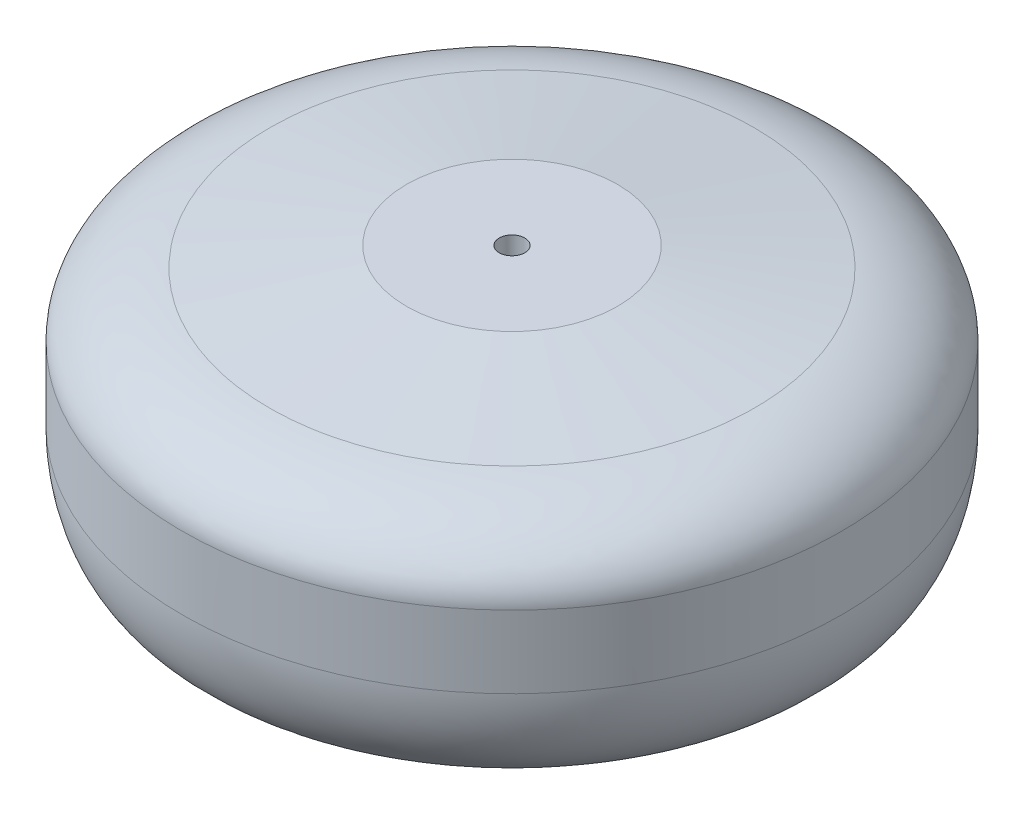
ISO-10303-21;
HEADER;
FILE_DESCRIPTION(('STEP AP214'),'2;1');
FILE_NAME('part.step','',(''),(''),'','','');
FILE_SCHEMA(('AUTOMOTIVE_DESIGN { 1 0 10303 214 1 1 1 1 }'));
ENDSEC;
DATA;
#1=APPLICATION_CONTEXT('core data for automotive mechanical design processes');
#2=APPLICATION_PROTOCOL_DEFINITION('international standard','automotive_design',2000,#1);
#3=PRODUCT_CONTEXT('',#1,'mechanical');
#4=PRODUCT('Part','Part','',(#3));
#5=PRODUCT_RELATED_PRODUCT_CATEGORY('part','',(#4));
#6=PRODUCT_DEFINITION_FORMATION('','',#4);
#7=PRODUCT_DEFINITION_CONTEXT('part definition',#1,'design');
#8=PRODUCT_DEFINITION('design','',#6,#7);
#9=PRODUCT_DEFINITION_SHAPE('','',#8);
#10=(LENGTH_UNIT() NAMED_UNIT(*) SI_UNIT(.MILLI.,.METRE.));
#11=(NAMED_UNIT(*) PLANE_ANGLE_UNIT() SI_UNIT($,.RADIAN.));
#12=(NAMED_UNIT(*) SI_UNIT($,.STERADIAN.) SOLID_ANGLE_UNIT());
#13=UNCERTAINTY_MEASURE_WITH_UNIT(LENGTH_MEASURE(1.E-05),#10,'distance_accuracy_value','');
#14=(GEOMETRIC_REPRESENTATION_CONTEXT(3) GLOBAL_UNCERTAINTY_ASSIGNED_CONTEXT((#13)) GLOBAL_UNIT_ASSIGNED_CONTEXT((#10,
#11,#12)) REPRESENTATION_CONTEXT('',''));
#15=CARTESIAN_POINT('',(0.,0.,0.));
#16=DIRECTION('',(0.,0.,1.));
#17=DIRECTION('',(1.,0.,0.));
#18=AXIS2_PLACEMENT_3D('',#15,#16,#17);
#19=CARTESIAN_POINT('',(0.,43.,0.));
#20=DIRECTION('',(0.,-1.,0.));
#21=DIRECTION('',(0.,0.,-1.));
#22=AXIS2_PLACEMENT_3D('',#19,#20,#21);
#23=CYLINDRICAL_SURFACE('',#22,22.5);
#24=CARTESIAN_POINT('',(0.,7.5,0.));
#25=DIRECTION('',(0.,1.,0.));
#26=DIRECTION('',(0.,0.,1.));
#27=AXIS2_PLACEMENT_3D('',#24,#25,#26);
#28=CIRCLE('',#27,22.5);
#29=CARTESIAN_POINT('',(0.,7.5,22.5));
#30=VERTEX_POINT('',#29);
#31=EDGE_CURVE('E169',#30,#30,#28,.T.);
#32=ORIENTED_EDGE('',*,*,#31,.T.);
#33=EDGE_LOOP('',(#32));
#34=FACE_BOUND('',#33,.T.);
#35=CARTESIAN_POINT('',(0.,0.857142857142858,0.));
#36=DIRECTION('',(0.,1.,0.));
#37=DIRECTION('',(0.,0.,1.));
#38=AXIS2_PLACEMENT_3D('',#35,#36,#37);
#39=CIRCLE('',#38,22.5);
#40=CARTESIAN_POINT('',(0.,0.857142857142858,22.5));
#41=VERTEX_POINT('',#40);
#42=EDGE_CURVE('E452',#41,#41,#39,.F.);
#43=ORIENTED_EDGE('',*,*,#42,.T.);
#44=EDGE_LOOP('',(#43));
#45=FACE_BOUND('',#44,.T.);
#46=ADVANCED_FACE('F48',(#34,#45),#23,.F.);
#47=CARTESIAN_POINT('',(0.,43.,0.));
#48=DIRECTION('',(0.,1.,0.));
#49=DIRECTION('',(0.,0.,1.));
#50=AXIS2_PLACEMENT_3D('',#47,#48,#49);
#51=PLANE('',#50);
#52=CARTESIAN_POINT('',(0.,43.,0.));
#53=DIRECTION('',(0.,1.,0.));
#54=DIRECTION('',(0.,0.,1.));
#55=AXIS2_PLACEMENT_3D('',#52,#53,#54);
#56=CIRCLE('',#55,2.);
#57=CARTESIAN_POINT('',(0.,43.,2.));
#58=VERTEX_POINT('',#57);
#59=EDGE_CURVE('E151',#58,#58,#56,.T.);
#60=ORIENTED_EDGE('',*,*,#59,.F.);
#61=EDGE_LOOP('',(#60));
#62=FACE_BOUND('',#61,.T.);
#63=CARTESIAN_POINT('',(0.,43.,0.));
#64=DIRECTION('',(0.,-1.,0.));
#65=DIRECTION('',(0.,0.,-1.));
#66=AXIS2_PLACEMENT_3D('',#63,#64,#65);
#67=CIRCLE('',#66,16.5);
#68=CARTESIAN_POINT('',(0.,43.,-16.5));
#69=VERTEX_POINT('',#68);
#70=EDGE_CURVE('E449',#69,#69,#67,.T.);
#71=ORIENTED_EDGE('',*,*,#70,.F.);
#72=EDGE_LOOP('',(#71));
#73=FACE_BOUND('',#72,.T.);
#74=ADVANCED_FACE('F237',(#62,#73),#51,.T.);
#75=CARTESIAN_POINT('',(0.,7.5,0.));
#76=DIRECTION('',(0.,1.,0.));
#77=DIRECTION('',(0.,0.,1.));
#78=AXIS2_PLACEMENT_3D('',#75,#76,#77);
#79=PLANE('',#78);
#80=ORIENTED_EDGE('',*,*,#31,.F.);
#81=EDGE_LOOP('',(#80));
#82=FACE_BOUND('',#81,.T.);
#83=DIRECTION('',(-0.866025403784439,0.,0.5));
#84=VECTOR('',#83,1.);
#85=CARTESIAN_POINT('',(6.05,7.5,3.49296912859724));
#86=LINE('',#85,#84);
#87=CARTESIAN_POINT('',(6.05,7.5,3.49296912859724));
#88=VERTEX_POINT('',#87);
#89=CARTESIAN_POINT('',(0.,7.5,6.98593825719447));
#90=VERTEX_POINT('',#89);
#91=EDGE_CURVE('E147',#88,#90,#86,.T.);
#92=ORIENTED_EDGE('',*,*,#91,.F.);
#93=DIRECTION('',(0.,0.,1.));
#94=VECTOR('',#93,1.);
#95=CARTESIAN_POINT('',(6.05,7.5,-3.49296912859724));
#96=LINE('',#95,#94);
#97=CARTESIAN_POINT('',(6.05,7.5,-3.49296912859724));
#98=VERTEX_POINT('',#97);
#99=EDGE_CURVE('E163',#98,#88,#96,.T.);
#100=ORIENTED_EDGE('',*,*,#99,.F.);
#101=DIRECTION('',(0.866025403784439,0.,0.5));
#102=VECTOR('',#101,1.);
#103=CARTESIAN_POINT('',(0.,7.5,-6.98593825719447));
#104=LINE('',#103,#102);
#105=CARTESIAN_POINT('',(0.,7.5,-6.98593825719447));
#106=VERTEX_POINT('',#105);
#107=EDGE_CURVE('E70',#106,#98,#104,.T.);
#108=ORIENTED_EDGE('',*,*,#107,.F.);
#109=DIRECTION('',(0.866025403784439,0.,-0.5));
#110=VECTOR('',#109,1.);
#111=CARTESIAN_POINT('',(-6.05,7.5,-3.49296912859724));
#112=LINE('',#111,#110);
#113=CARTESIAN_POINT('',(-6.05,7.5,-3.49296912859724));
#114=VERTEX_POINT('',#113);
#115=EDGE_CURVE('E120',#114,#106,#112,.T.);
#116=ORIENTED_EDGE('',*,*,#115,.F.);
#117=DIRECTION('',(0.,0.,-1.));
#118=VECTOR('',#117,1.);
#119=CARTESIAN_POINT('',(-6.05,7.5,3.49296912859724));
#120=LINE('',#119,#118);
#121=CARTESIAN_POINT('',(-6.05,7.5,3.49296912859724));
#122=VERTEX_POINT('',#121);
#123=EDGE_CURVE('E155',#122,#114,#120,.T.);
#124=ORIENTED_EDGE('',*,*,#123,.F.);
#125=DIRECTION('',(-0.866025403784439,0.,-0.5));
#126=VECTOR('',#125,1.);
#127=CARTESIAN_POINT('',(0.,7.5,6.98593825719447));
#128=LINE('',#127,#126);
#129=EDGE_CURVE('E150',#90,#122,#128,.T.);
#130=ORIENTED_EDGE('',*,*,#129,.F.);
#131=EDGE_LOOP('',(#92,#100,#108,#116,#124,#130));
#132=FACE_BOUND('',#131,.T.);
#133=ADVANCED_FACE('F234',(#82,#132),#79,.F.);
#134=CARTESIAN_POINT('',(6.05,20.,3.49296912859724));
#135=DIRECTION('',(0.5,0.,0.866025403784439));
#136=DIRECTION('',(0.866025403784439,0.,-0.5));
#137=AXIS2_PLACEMENT_3D('',#134,#135,#136);
#138=PLANE('',#137);
#139=ORIENTED_EDGE('',*,*,#91,.T.);
#140=DIRECTION('',(0.,-1.,0.));
#141=VECTOR('',#140,1.);
#142=CARTESIAN_POINT('',(0.,20.,6.98593825719447));
#143=LINE('',#142,#141);
#144=CARTESIAN_POINT('',(0.,20.,6.98593825719447));
#145=VERTEX_POINT('',#144);
#146=EDGE_CURVE('E102',#145,#90,#143,.T.);
#147=ORIENTED_EDGE('',*,*,#146,.F.);
#148=DIRECTION('',(-0.866025403784439,0.,0.5));
#149=VECTOR('',#148,1.);
#150=CARTESIAN_POINT('',(6.05,20.,3.49296912859724));
#151=LINE('',#150,#149);
#152=CARTESIAN_POINT('',(6.05,20.,3.49296912859724));
#153=VERTEX_POINT('',#152);
#154=EDGE_CURVE('E166',#153,#145,#151,.T.);
#155=ORIENTED_EDGE('',*,*,#154,.F.);
#156=DIRECTION('',(0.,-1.,0.));
#157=VECTOR('',#156,1.);
#158=CARTESIAN_POINT('',(6.05,20.,3.49296912859724));
#159=LINE('',#158,#157);
#160=EDGE_CURVE('E79',#153,#88,#159,.T.);
#161=ORIENTED_EDGE('',*,*,#160,.T.);
#162=EDGE_LOOP('',(#139,#147,#155,#161));
#163=FACE_BOUND('',#162,.T.);
#164=ADVANCED_FACE('F220',(#163),#138,.F.);
#165=CARTESIAN_POINT('',(6.05,20.,-3.49296912859724));
#166=DIRECTION('',(1.,0.,0.));
#167=DIRECTION('',(0.,0.,-1.));
#168=AXIS2_PLACEMENT_3D('',#165,#166,#167);
#169=PLANE('',#168);
#170=ORIENTED_EDGE('',*,*,#99,.T.);
#171=ORIENTED_EDGE('',*,*,#160,.F.);
#172=DIRECTION('',(0.,0.,1.));
#173=VECTOR('',#172,1.);
#174=CARTESIAN_POINT('',(6.05,20.,-3.49296912859724));
#175=LINE('',#174,#173);
#176=CARTESIAN_POINT('',(6.05,20.,-3.49296912859724));
#177=VERTEX_POINT('',#176);
#178=EDGE_CURVE('E131',#177,#153,#175,.T.);
#179=ORIENTED_EDGE('',*,*,#178,.F.);
#180=DIRECTION('',(0.,-1.,0.));
#181=VECTOR('',#180,1.);
#182=CARTESIAN_POINT('',(6.05,20.,-3.49296912859724));
#183=LINE('',#182,#181);
#184=EDGE_CURVE('E122',#177,#98,#183,.T.);
#185=ORIENTED_EDGE('',*,*,#184,.T.);
#186=EDGE_LOOP('',(#170,#171,#179,#185));
#187=FACE_BOUND('',#186,.T.);
#188=ADVANCED_FACE('F217',(#187),#169,.F.);
#189=CARTESIAN_POINT('',(0.,20.,-6.98593825719447));
#190=DIRECTION('',(0.5,0.,-0.866025403784439));
#191=DIRECTION('',(-0.866025403784439,0.,-0.5));
#192=AXIS2_PLACEMENT_3D('',#189,#190,#191);
#193=PLANE('',#192);
#194=ORIENTED_EDGE('',*,*,#107,.T.);
#195=ORIENTED_EDGE('',*,*,#184,.F.);
#196=DIRECTION('',(0.866025403784439,0.,0.5));
#197=VECTOR('',#196,1.);
#198=CARTESIAN_POINT('',(0.,20.,-6.98593825719447));
#199=LINE('',#198,#197);
#200=CARTESIAN_POINT('',(0.,20.,-6.98593825719447));
#201=VERTEX_POINT('',#200);
#202=EDGE_CURVE('E126',#201,#177,#199,.T.);
#203=ORIENTED_EDGE('',*,*,#202,.F.);
#204=DIRECTION('',(0.,-1.,0.));
#205=VECTOR('',#204,1.);
#206=CARTESIAN_POINT('',(0.,20.,-6.98593825719447));
#207=LINE('',#206,#205);
#208=EDGE_CURVE('E113',#201,#106,#207,.T.);
#209=ORIENTED_EDGE('',*,*,#208,.T.);
#210=EDGE_LOOP('',(#194,#195,#203,#209));
#211=FACE_BOUND('',#210,.T.);
#212=ADVANCED_FACE('F127',(#211),#193,.F.);
#213=CARTESIAN_POINT('',(-6.05,20.,-3.49296912859724));
#214=DIRECTION('',(-0.5,0.,-0.866025403784439));
#215=DIRECTION('',(-0.866025403784439,0.,0.5));
#216=AXIS2_PLACEMENT_3D('',#213,#214,#215);
#217=PLANE('',#216);
#218=ORIENTED_EDGE('',*,*,#115,.T.);
#219=ORIENTED_EDGE('',*,*,#208,.F.);
#220=DIRECTION('',(0.866025403784439,0.,-0.5));
#221=VECTOR('',#220,1.);
#222=CARTESIAN_POINT('',(-6.05,20.,-3.49296912859724));
#223=LINE('',#222,#221);
#224=CARTESIAN_POINT('',(-6.05,20.,-3.49296912859724));
#225=VERTEX_POINT('',#224);
#226=EDGE_CURVE('E117',#225,#201,#223,.T.);
#227=ORIENTED_EDGE('',*,*,#226,.F.);
#228=DIRECTION('',(0.,-1.,0.));
#229=VECTOR('',#228,1.);
#230=CARTESIAN_POINT('',(-6.05,20.,-3.49296912859724));
#231=LINE('',#230,#229);
#232=EDGE_CURVE('E123',#225,#114,#231,.T.);
#233=ORIENTED_EDGE('',*,*,#232,.T.);
#234=EDGE_LOOP('',(#218,#219,#227,#233));
#235=FACE_BOUND('',#234,.T.);
#236=ADVANCED_FACE('F115',(#235),#217,.F.);
#237=CARTESIAN_POINT('',(-6.05,20.,3.49296912859724));
#238=DIRECTION('',(-1.,0.,0.));
#239=DIRECTION('',(0.,0.,1.));
#240=AXIS2_PLACEMENT_3D('',#237,#238,#239);
#241=PLANE('',#240);
#242=ORIENTED_EDGE('',*,*,#123,.T.);
#243=ORIENTED_EDGE('',*,*,#232,.F.);
#244=DIRECTION('',(0.,0.,-1.));
#245=VECTOR('',#244,1.);
#246=CARTESIAN_POINT('',(-6.05,20.,3.49296912859724));
#247=LINE('',#246,#245);
#248=CARTESIAN_POINT('',(-6.05,20.,3.49296912859724));
#249=VERTEX_POINT('',#248);
#250=EDGE_CURVE('E137',#249,#225,#247,.T.);
#251=ORIENTED_EDGE('',*,*,#250,.F.);
#252=DIRECTION('',(0.,-1.,0.));
#253=VECTOR('',#252,1.);
#254=CARTESIAN_POINT('',(-6.05,20.,3.49296912859724));
#255=LINE('',#254,#253);
#256=EDGE_CURVE('E174',#249,#122,#255,.T.);
#257=ORIENTED_EDGE('',*,*,#256,.T.);
#258=EDGE_LOOP('',(#242,#243,#251,#257));
#259=FACE_BOUND('',#258,.T.);
#260=ADVANCED_FACE('F225',(#259),#241,.F.);
#261=CARTESIAN_POINT('',(0.,20.,6.98593825719447));
#262=DIRECTION('',(-0.5,0.,0.866025403784439));
#263=DIRECTION('',(0.866025403784439,0.,0.5));
#264=AXIS2_PLACEMENT_3D('',#261,#262,#263);
#265=PLANE('',#264);
#266=ORIENTED_EDGE('',*,*,#129,.T.);
#267=ORIENTED_EDGE('',*,*,#256,.F.);
#268=DIRECTION('',(-0.866025403784439,0.,-0.5));
#269=VECTOR('',#268,1.);
#270=CARTESIAN_POINT('',(0.,20.,6.98593825719447));
#271=LINE('',#270,#269);
#272=EDGE_CURVE('E141',#145,#249,#271,.T.);
#273=ORIENTED_EDGE('',*,*,#272,.F.);
#274=ORIENTED_EDGE('',*,*,#146,.T.);
#275=EDGE_LOOP('',(#266,#267,#273,#274));
#276=FACE_BOUND('',#275,.T.);
#277=ADVANCED_FACE('F215',(#276),#265,.F.);
#278=CARTESIAN_POINT('',(0.,20.,0.));
#279=DIRECTION('',(0.,-1.,0.));
#280=DIRECTION('',(0.,0.,-1.));
#281=AXIS2_PLACEMENT_3D('',#278,#279,#280);
#282=PLANE('',#281);
#283=CARTESIAN_POINT('',(0.,20.,0.));
#284=DIRECTION('',(0.,-1.,0.));
#285=DIRECTION('',(0.,0.,-1.));
#286=AXIS2_PLACEMENT_3D('',#283,#284,#285);
#287=CIRCLE('',#286,2.);
#288=CARTESIAN_POINT('',(0.,20.,-2.));
#289=VERTEX_POINT('',#288);
#290=EDGE_CURVE('E186',#289,#289,#287,.T.);
#291=ORIENTED_EDGE('',*,*,#290,.F.);
#292=EDGE_LOOP('',(#291));
#293=FACE_BOUND('',#292,.T.);
#294=ORIENTED_EDGE('',*,*,#154,.T.);
#295=ORIENTED_EDGE('',*,*,#272,.T.);
#296=ORIENTED_EDGE('',*,*,#250,.T.);
#297=ORIENTED_EDGE('',*,*,#226,.T.);
#298=ORIENTED_EDGE('',*,*,#202,.T.);
#299=ORIENTED_EDGE('',*,*,#178,.T.);
#300=EDGE_LOOP('',(#294,#295,#296,#297,#298,#299));
#301=FACE_BOUND('',#300,.T.);
#302=ADVANCED_FACE('F134',(#293,#301),#282,.T.);
#303=CARTESIAN_POINT('',(0.,143.,0.));
#304=DIRECTION('',(0.,-1.,0.));
#305=DIRECTION('',(0.,0.,-1.));
#306=AXIS2_PLACEMENT_3D('',#303,#304,#305);
#307=CYLINDRICAL_SURFACE('',#306,2.);
#308=ORIENTED_EDGE('',*,*,#59,.T.);
#309=EDGE_LOOP('',(#308));
#310=FACE_BOUND('',#309,.T.);
#311=ORIENTED_EDGE('',*,*,#290,.T.);
#312=EDGE_LOOP('',(#311));
#313=FACE_BOUND('',#312,.T.);
#314=ADVANCED_FACE('F208',(#310,#313),#307,.F.);
#315=CARTESIAN_POINT('',(0.,0.,0.));
#316=DIRECTION('',(0.,1.,0.));
#317=DIRECTION('',(0.,0.,1.));
#318=AXIS2_PLACEMENT_3D('',#315,#316,#317);
#319=CONICAL_SURFACE('',#318,16.5,1.42889927219073);
#320=CARTESIAN_POINT('',(0.,3.87447433479423,-43.6213203435596));
#321=CARTESIAN_POINT('',(-5.71001747991467,3.87447433479423,-43.6213203435596));
#322=CARTESIAN_POINT('',(-11.4177883133907,3.87447433479568,-42.4859741346244));
#323=CARTESIAN_POINT('',(-21.9685248733502,3.87447433479278,-38.1157159584416));
#324=CARTESIAN_POINT('',(-26.8073393384969,3.8744743347933,-34.8825234999773));
#325=CARTESIAN_POINT('',(-34.8825234999866,3.87447433479517,-26.8073393385061));
#326=CARTESIAN_POINT('',(-38.1157159584796,3.87447433479462,-21.9685248732919));
#327=CARTESIAN_POINT('',(-42.4859741345862,3.87447433479384,-11.4177883134492));
#328=CARTESIAN_POINT('',(-43.6213203435596,3.87447433479423,-5.71001747986203));
#329=CARTESIAN_POINT('',(-43.6213203435596,3.87447433479423,5.71001747986209));
#330=CARTESIAN_POINT('',(-42.4859741346049,3.87447433479527,11.4177883134302));
#331=CARTESIAN_POINT('',(-38.115715958461,3.87447433479319,21.9685248733108));
#332=CARTESIAN_POINT('',(-34.8825235000434,3.87447433479423,26.80733933844));
#333=CARTESIAN_POINT('',(-26.80733933844,3.87447433479423,34.8825235000435));
#334=CARTESIAN_POINT('',(-21.9685248733043,3.87447433479472,38.1157159584752));
#335=CARTESIAN_POINT('',(-11.4177883134367,3.87447433479375,42.4859741345907));
#336=CARTESIAN_POINT('',(-5.71001747992563,3.87447433479423,43.6213203435596));
#337=CARTESIAN_POINT('',(5.71001747992563,3.87447433479423,43.6213203435596));
#338=CARTESIAN_POINT('',(11.4177883133896,3.87447433479366,42.4859741346095));
#339=CARTESIAN_POINT('',(21.9685248733514,3.8744743347948,38.1157159584564));
#340=CARTESIAN_POINT('',(26.8073393384956,3.87447433479404,34.882523499986));
#341=CARTESIAN_POINT('',(34.8825234999878,3.87447433479442,26.8073393384975));
#342=CARTESIAN_POINT('',(38.1157159584608,3.87447433479471,21.968524873339));
#343=CARTESIAN_POINT('',(42.4859741346051,3.87447433479376,11.417788313402));
#344=CARTESIAN_POINT('',(43.6213203435596,3.87447433479423,5.71001747991468));
#345=CARTESIAN_POINT('',(43.6213203435596,3.87447433479423,-5.71001747991467));
#346=CARTESIAN_POINT('',(42.4859741346052,3.87447433479325,-11.4177883133927));
#347=CARTESIAN_POINT('',(38.1157159584607,3.87447433479521,-21.9685248733484));
#348=CARTESIAN_POINT('',(34.8825234999866,3.87447433479423,-26.8073393384968));
#349=CARTESIAN_POINT('',(26.8073393384968,3.87447433479423,-34.8825234999867));
#350=CARTESIAN_POINT('',(21.9685248733408,3.87447433479472,-38.1157159584601));
#351=CARTESIAN_POINT('',(11.4177883134004,3.87447433479375,-42.4859741346058));
#352=CARTESIAN_POINT('',(5.71001747991468,3.87447433479423,-43.6213203435596));
#353=CARTESIAN_POINT('',(0.,3.87447433479423,-43.6213203435596));
#354=(BOUNDED_CURVE() B_SPLINE_CURVE(3,(#320,#321,#322,#323,#324,#325,#326,#327,#328,#329,#330,
#331,#332,#333,#334,#335,#336,#337,#338,#339,#340,#341,#342,#343,#344,#345,#346,#347,#348,#349,
#350,#351,#352,#353),.UNSPECIFIED.,.T.,.F.) B_SPLINE_CURVE_WITH_KNOTS((4,2,2,2,2,2,2,2,2,2,2,2,
2,2,2,2,4),(-3.14159265358979,-2.74889357189107,-2.35619449019234,-1.96349540849362,
-1.5707963267949,-1.17809724509617,-0.785398163397448,-0.392699081698724,0.,0.392699081698724,
0.785398163397448,1.17809724509617,1.5707963267949,1.96349540849362,2.35619449019234,
2.74889357189107,3.14159265358979),
.UNSPECIFIED.) CURVE() GEOMETRIC_REPRESENTATION_ITEM() RATIONAL_B_SPLINE_CURVE((1.,1.,1.,1.,1.,
1.,1.,1.,1.,1.,1.,1.,1.,1.,1.,1.,1.,1.,1.,1.,1.,1.,1.,1.,1.,1.,1.,1.,1.,1.,1.,1.,1.,1.)) REPRESENTATION_ITEM(''));
#355=CARTESIAN_POINT('',(0.,3.87447433479423,-43.6213203435596));
#356=VERTEX_POINT('',#355);
#357=EDGE_CURVE('E182',#356,#356,#354,.F.);
#358=ORIENTED_EDGE('',*,*,#357,.T.);
#359=EDGE_LOOP('',(#358));
#360=FACE_BOUND('',#359,.T.);
#361=ORIENTED_EDGE('',*,*,#42,.F.);
#362=EDGE_LOOP('',(#361));
#363=FACE_BOUND('',#362,.T.);
#364=ADVANCED_FACE('F197',(#360,#363),#319,.T.);
#365=CARTESIAN_POINT('',(0.,38.,0.));
#366=DIRECTION('',(0.,-1.,0.));
#367=DIRECTION('',(0.,0.,-1.));
#368=AXIS2_PLACEMENT_3D('',#365,#366,#367);
#369=CONICAL_SURFACE('',#368,51.5,1.42889927219073);
#370=CARTESIAN_POINT('',(0.,39.9408266339467,-37.9142135623731));
#371=CARTESIAN_POINT('',(4.96295894914225,39.9408266339467,-37.9142135623731));
#372=CARTESIAN_POINT('',(9.92396518766095,39.9408266339447,-36.9274080669004));
#373=CARTESIAN_POINT('',(19.094317575283,39.9408266339487,-33.1289237361763));
#374=CARTESIAN_POINT('',(23.3000555856224,39.9408266339467,-30.3187394409955));
#375=CARTESIAN_POINT('',(30.3187394409955,39.9408266339467,-23.3000555856224));
#376=CARTESIAN_POINT('',(33.1289237362128,39.9408266339444,-19.0943175752735));
#377=CARTESIAN_POINT('',(36.9274080668639,39.940826633949,-9.92396518767046));
#378=CARTESIAN_POINT('',(37.9142135623731,39.9408266339467,-4.96295894913687));
#379=CARTESIAN_POINT('',(37.9142135623731,39.9408266339467,4.96295894913686));
#380=CARTESIAN_POINT('',(36.9274080668802,39.9408266339468,9.92396518767038));
#381=CARTESIAN_POINT('',(33.1289237361965,39.9408266339466,19.0943175752736));
#382=CARTESIAN_POINT('',(30.3187394409908,39.9408266339467,23.3000555856272));
#383=CARTESIAN_POINT('',(23.3000555856271,39.9408266339467,30.3187394409908));
#384=CARTESIAN_POINT('',(19.0943175752735,39.9408266339464,33.1289237361976));
#385=CARTESIAN_POINT('',(9.92396518767056,39.940826633947,36.927408066879));
#386=CARTESIAN_POINT('',(4.96295894913687,39.9408266339467,37.9142135623731));
#387=CARTESIAN_POINT('',(-4.96295894913686,39.9408266339467,37.9142135623731));
#388=CARTESIAN_POINT('',(-9.92396518767458,39.9408266339468,36.927408066879));
#389=CARTESIAN_POINT('',(-19.0943175752693,39.9408266339466,33.1289237361977));
#390=CARTESIAN_POINT('',(-23.300055585619,39.9408266339483,30.3187394409827));
#391=CARTESIAN_POINT('',(-30.318739440999,39.9408266339451,23.3000555856353));
#392=CARTESIAN_POINT('',(-33.1289237361976,39.9408266339464,19.0943175752735));
#393=CARTESIAN_POINT('',(-36.927408066879,39.940826633947,9.92396518767055));
#394=CARTESIAN_POINT('',(-37.9142135623731,39.9408266339467,4.96295894913681));
#395=CARTESIAN_POINT('',(-37.9142135623731,39.9408266339467,-4.96295894913693));
#396=CARTESIAN_POINT('',(-36.9274080668791,39.9408266339472,-9.92396518766631));
#397=CARTESIAN_POINT('',(-33.1289237361976,39.9408266339462,-19.0943175752775));
#398=CARTESIAN_POINT('',(-30.3187394409828,39.9408266339483,-23.300055585619));
#399=CARTESIAN_POINT('',(-23.3000555856354,39.9408266339451,-30.3187394409989));
#400=CARTESIAN_POINT('',(-19.0943175752735,39.9408266339464,-33.1289237361976));
#401=CARTESIAN_POINT('',(-9.92396518767056,39.940826633947,-36.927408066879));
#402=CARTESIAN_POINT('',(-4.96295894914225,39.9408266339467,-37.9142135623731));
#403=CARTESIAN_POINT('',(0.,39.9408266339467,-37.9142135623731));
#404=(BOUNDED_CURVE() B_SPLINE_CURVE(3,(#370,#371,#372,#373,#374,#375,#376,#377,#378,#379,#380,
#381,#382,#383,#384,#385,#386,#387,#388,#389,#390,#391,#392,#393,#394,#395,#396,#397,#398,#399,
#400,#401,#402,#403),.UNSPECIFIED.,.T.,.F.) B_SPLINE_CURVE_WITH_KNOTS((4,2,2,2,2,2,2,2,2,2,2,2,
2,2,2,2,4),(0.,0.392699081698724,0.785398163397448,1.17809724509617,1.5707963267949,
1.96349540849362,2.35619449019234,2.74889357189107,3.14159265358979,3.53429173528852,
3.92699081698724,4.31968989868597,4.71238898038469,5.10508806208341,5.49778714378214,
5.89048622548086,6.28318530717959),
.UNSPECIFIED.) CURVE() GEOMETRIC_REPRESENTATION_ITEM() RATIONAL_B_SPLINE_CURVE((1.,1.,1.,1.,1.,
1.,1.,1.,1.,1.,1.,1.,1.,1.,1.,1.,1.,1.,1.,1.,1.,1.,1.,1.,1.,1.,1.,1.,1.,1.,1.,1.,1.,1.)) REPRESENTATION_ITEM(''));
#405=CARTESIAN_POINT('',(0.,39.9408266339467,-37.9142135623731));
#406=VERTEX_POINT('',#405);
#407=EDGE_CURVE('E12',#406,#406,#404,.F.);
#408=ORIENTED_EDGE('',*,*,#407,.T.);
#409=EDGE_LOOP('',(#408));
#410=FACE_BOUND('',#409,.T.);
#411=ORIENTED_EDGE('',*,*,#70,.T.);
#412=EDGE_LOOP('',(#411));
#413=FACE_BOUND('',#412,.T.);
#414=ADVANCED_FACE('F207',(#410,#413),#369,.T.);
#415=CARTESIAN_POINT('',(0.,43.,0.));
#416=DIRECTION('',(0.,-1.,0.));
#417=DIRECTION('',(0.,0.,-1.));
#418=AXIS2_PLACEMENT_3D('',#415,#416,#417);
#419=CYLINDRICAL_SURFACE('',#418,51.5);
#420=CARTESIAN_POINT('',(0.,18.7237167397117,-51.5));
#421=CARTESIAN_POINT('',(6.74133423517573,18.7237167397117,-51.5));
#422=CARTESIAN_POINT('',(13.4800160451075,18.7237167397117,-50.1595928481679));
#423=CARTESIAN_POINT('',(25.9363774884969,18.7237167397117,-44.9999990004946));
#424=CARTESIAN_POINT('',(31.6491560791653,18.7237167397117,-41.1828423830491));
#425=CARTESIAN_POINT('',(41.182842383049,18.7237167397117,-31.6491560791654));
#426=CARTESIAN_POINT('',(44.9999990004962,18.7237167397117,-25.936377488493));
#427=CARTESIAN_POINT('',(50.1595928481663,18.7237167397117,-13.4800160451112));
#428=CARTESIAN_POINT('',(51.5,18.7237167397117,-6.74133423517572));
#429=CARTESIAN_POINT('',(51.5,18.7237167397117,6.74133423517573));
#430=CARTESIAN_POINT('',(50.1595928481663,18.7237167397117,13.4800160451112));
#431=CARTESIAN_POINT('',(44.9999990004963,18.7237167397117,25.936377488493));
#432=CARTESIAN_POINT('',(41.1828423830553,18.7237167397117,31.6491560791591));
#433=CARTESIAN_POINT('',(31.6491560791591,18.7237167397117,41.1828423830553));
#434=CARTESIAN_POINT('',(25.9363774884993,18.7237167397117,44.9999990004936));
#435=CARTESIAN_POINT('',(13.4800160451049,18.7237167397117,50.1595928481689));
#436=CARTESIAN_POINT('',(6.74133423518865,18.7237167397117,51.5));
#437=CARTESIAN_POINT('',(-6.74133423518865,18.7237167397117,51.5));
#438=CARTESIAN_POINT('',(-13.4800160451518,18.7237167397117,50.1595928481495));
#439=CARTESIAN_POINT('',(-25.9363774884524,18.7237167397117,44.9999990005131));
#440=CARTESIAN_POINT('',(-31.6491560791025,18.7237167397117,41.1828423831119));
#441=CARTESIAN_POINT('',(-41.1828423831119,18.7237167397117,31.6491560791025));
#442=CARTESIAN_POINT('',(-44.9999990005129,18.7237167397117,25.9363774884528));
#443=CARTESIAN_POINT('',(-50.1595928481496,18.7237167397117,13.4800160451515));
#444=CARTESIAN_POINT('',(-51.5,18.7237167397117,6.74133423511363));
#445=CARTESIAN_POINT('',(-51.5,18.7237167397117,-6.74133423511356));
#446=CARTESIAN_POINT('',(-50.1595928481402,18.7237167397117,-13.4800160451743));
#447=CARTESIAN_POINT('',(-44.9999990005223,18.7237167397117,-25.9363774884301));
#448=CARTESIAN_POINT('',(-41.1828423830396,18.7237167397117,-31.6491560791747));
#449=CARTESIAN_POINT('',(-31.6491560791748,18.7237167397117,-41.1828423830396));
#450=CARTESIAN_POINT('',(-25.9363774885007,18.7237167397117,-44.9999990004931));
#451=CARTESIAN_POINT('',(-13.4800160451034,18.7237167397117,-50.1595928481695));
#452=CARTESIAN_POINT('',(-6.74133423517571,18.7237167397117,-51.5));
#453=CARTESIAN_POINT('',(0.,18.7237167397117,-51.5));
#454=(BOUNDED_CURVE() B_SPLINE_CURVE(3,(#420,#421,#422,#423,#424,#425,#426,#427,#428,#429,#430,
#431,#432,#433,#434,#435,#436,#437,#438,#439,#440,#441,#442,#443,#444,#445,#446,#447,#448,#449,
#450,#451,#452,#453),.UNSPECIFIED.,.T.,.F.) B_SPLINE_CURVE_WITH_KNOTS((4,2,2,2,2,2,2,2,2,2,2,2,
2,2,2,2,4),(-3.14159265358979,-2.74889357189107,-2.35619449019234,-1.96349540849362,
-1.5707963267949,-1.17809724509617,-0.785398163397448,-0.392699081698724,0.,0.392699081698724,
0.785398163397448,1.17809724509617,1.5707963267949,1.96349540849362,2.35619449019234,
2.74889357189107,3.14159265358979),
.UNSPECIFIED.) CURVE() GEOMETRIC_REPRESENTATION_ITEM() RATIONAL_B_SPLINE_CURVE((1.,1.,1.,1.,1.,
1.,1.,1.,1.,1.,1.,1.,1.,1.,1.,1.,1.,1.,1.,1.,1.,1.,1.,1.,1.,1.,1.,1.,1.,1.,1.,1.,1.,1.)) REPRESENTATION_ITEM(''));
#455=CARTESIAN_POINT('',(0.,18.7237167397117,-51.5));
#456=VERTEX_POINT('',#455);
#457=EDGE_CURVE('E63',#456,#456,#454,.F.);
#458=ORIENTED_EDGE('',*,*,#457,.T.);
#459=EDGE_LOOP('',(#458));
#460=FACE_BOUND('',#459,.T.);
#461=CARTESIAN_POINT('',(0.,30.041331697335,-51.5));
#462=CARTESIAN_POINT('',(-6.74133423499206,30.041331697335,-51.5));
#463=CARTESIAN_POINT('',(-13.4800160452847,30.041331697335,-50.1595928480944));
#464=CARTESIAN_POINT('',(-25.9363774883197,30.041331697335,-44.999999000568));
#465=CARTESIAN_POINT('',(-31.6491560793091,30.041331697335,-41.1828423829053));
#466=CARTESIAN_POINT('',(-41.1828423829055,30.041331697335,-31.6491560793089));
#467=CARTESIAN_POINT('',(-44.9999990005647,30.041331697335,-25.9363774883278));
#468=CARTESIAN_POINT('',(-50.1595928480979,30.041331697335,-13.4800160452763));
#469=CARTESIAN_POINT('',(-51.5,30.041331697335,-6.74133423498484));
#470=CARTESIAN_POINT('',(-51.5,30.041331697335,6.74133423498467));
#471=CARTESIAN_POINT('',(-50.1595928480944,30.041331697335,13.4800160452847));
#472=CARTESIAN_POINT('',(-44.999999000568,30.041331697335,25.9363774883197));
#473=CARTESIAN_POINT('',(-41.1828423829137,30.041331697335,31.6491560793007));
#474=CARTESIAN_POINT('',(-31.6491560793008,30.041331697335,41.1828423829136));
#475=CARTESIAN_POINT('',(-25.9363774883137,30.041331697335,44.9999990005705));
#476=CARTESIAN_POINT('',(-13.4800160452904,30.041331697335,50.1595928480921));
#477=CARTESIAN_POINT('',(-6.74133423498474,30.041331697335,51.5));
#478=CARTESIAN_POINT('',(6.74133423498475,30.041331697335,51.5));
#479=CARTESIAN_POINT('',(13.4800160452847,30.041331697335,50.1595928480944));
#480=CARTESIAN_POINT('',(25.9363774883197,30.041331697335,44.999999000568));
#481=CARTESIAN_POINT('',(31.649156079309,30.041331697335,41.1828423829054));
#482=CARTESIAN_POINT('',(41.1828423829053,30.041331697335,31.6491560793091));
#483=CARTESIAN_POINT('',(44.999999000566,30.041331697335,25.9363774883245));
#484=CARTESIAN_POINT('',(50.1595928480965,30.041331697335,13.4800160452797));
#485=CARTESIAN_POINT('',(51.5,30.041331697335,6.74133423498474));
#486=CARTESIAN_POINT('',(51.5,30.041331697335,-6.74133423498475));
#487=CARTESIAN_POINT('',(50.1595928480965,30.041331697335,-13.4800160452797));
#488=CARTESIAN_POINT('',(44.999999000566,30.041331697335,-25.9363774883245));
#489=CARTESIAN_POINT('',(41.1828423829082,30.041331697335,-31.6491560793062));
#490=CARTESIAN_POINT('',(31.6491560793062,30.041331697335,-41.1828423829082));
#491=CARTESIAN_POINT('',(25.936377488343,30.041331697335,-44.9999990005584));
#492=CARTESIAN_POINT('',(13.4800160452612,30.041331697335,-50.1595928481041));
#493=CARTESIAN_POINT('',(6.74133423499206,30.041331697335,-51.5));
#494=CARTESIAN_POINT('',(0.,30.041331697335,-51.5));
#495=(BOUNDED_CURVE() B_SPLINE_CURVE(3,(#461,#462,#463,#464,#465,#466,#467,#468,#469,#470,#471,
#472,#473,#474,#475,#476,#477,#478,#479,#480,#481,#482,#483,#484,#485,#486,#487,#488,#489,#490,
#491,#492,#493,#494),.UNSPECIFIED.,.T.,.F.) B_SPLINE_CURVE_WITH_KNOTS((4,2,2,2,2,2,2,2,2,2,2,2,
2,2,2,2,4),(0.,0.392699081698725,0.785398163397448,1.17809724509617,1.5707963267949,
1.96349540849362,2.35619449019234,2.74889357189107,3.14159265358979,3.53429173528852,
3.92699081698724,4.31968989868597,4.71238898038469,5.10508806208341,5.49778714378214,
5.89048622548086,6.28318530717959),
.UNSPECIFIED.) CURVE() GEOMETRIC_REPRESENTATION_ITEM() RATIONAL_B_SPLINE_CURVE((1.,1.,1.,1.,1.,
1.,1.,1.,1.,1.,1.,1.,1.,1.,1.,1.,1.,1.,1.,1.,1.,1.,1.,1.,1.,1.,1.,1.,1.,1.,1.,1.,1.,1.)) REPRESENTATION_ITEM(''));
#496=CARTESIAN_POINT('',(0.,30.041331697335,-51.5));
#497=VERTEX_POINT('',#496);
#498=EDGE_CURVE('E303',#497,#497,#495,.F.);
#499=ORIENTED_EDGE('',*,*,#498,.T.);
#500=EDGE_LOOP('',(#499));
#501=FACE_BOUND('',#500,.T.);
#502=ADVANCED_FACE('F245',(#460,#501),#419,.T.);
#503=CARTESIAN_POINT('',(0.,18.7237167397117,-51.5));
#504=CARTESIAN_POINT('',(-6.74133423517571,18.7237167397117,-51.5));
#505=CARTESIAN_POINT('',(-13.4800160451034,18.7237167397117,-50.1595928481695));
#506=CARTESIAN_POINT('',(-25.9363774885007,18.7237167397117,-44.9999990004931));
#507=CARTESIAN_POINT('',(-31.6491560791748,18.7237167397117,-41.1828423830396));
#508=CARTESIAN_POINT('',(-41.1828423830396,18.7237167397117,-31.6491560791747));
#509=CARTESIAN_POINT('',(-44.9999990005223,18.7237167397117,-25.9363774884301));
#510=CARTESIAN_POINT('',(-50.1595928481402,18.7237167397117,-13.4800160451743));
#511=CARTESIAN_POINT('',(-51.5,18.7237167397117,-6.74133423511356));
#512=CARTESIAN_POINT('',(-51.5,18.7237167397117,6.74133423511363));
#513=CARTESIAN_POINT('',(-50.1595928481496,18.7237167397117,13.4800160451515));
#514=CARTESIAN_POINT('',(-44.9999990005129,18.7237167397117,25.9363774884528));
#515=CARTESIAN_POINT('',(-41.1828423831119,18.7237167397117,31.6491560791025));
#516=CARTESIAN_POINT('',(-31.6491560791025,18.7237167397117,41.1828423831119));
#517=CARTESIAN_POINT('',(-25.9363774884524,18.7237167397117,44.9999990005131));
#518=CARTESIAN_POINT('',(-13.4800160451518,18.7237167397117,50.1595928481495));
#519=CARTESIAN_POINT('',(-6.74133423518865,18.7237167397117,51.5));
#520=CARTESIAN_POINT('',(6.74133423518865,18.7237167397117,51.5));
#521=CARTESIAN_POINT('',(13.4800160451049,18.7237167397117,50.1595928481689));
#522=CARTESIAN_POINT('',(25.9363774884993,18.7237167397117,44.9999990004936));
#523=CARTESIAN_POINT('',(31.6491560791591,18.7237167397117,41.1828423830553));
#524=CARTESIAN_POINT('',(41.1828423830553,18.7237167397117,31.6491560791591));
#525=CARTESIAN_POINT('',(44.9999990004963,18.7237167397117,25.936377488493));
#526=CARTESIAN_POINT('',(50.1595928481663,18.7237167397117,13.4800160451112));
#527=CARTESIAN_POINT('',(51.5,18.7237167397117,6.74133423517573));
#528=CARTESIAN_POINT('',(51.5,18.7237167397117,-6.74133423517572));
#529=CARTESIAN_POINT('',(50.1595928481663,18.7237167397117,-13.4800160451112));
#530=CARTESIAN_POINT('',(44.9999990004962,18.7237167397117,-25.936377488493));
#531=CARTESIAN_POINT('',(41.182842383049,18.7237167397117,-31.6491560791654));
#532=CARTESIAN_POINT('',(31.6491560791653,18.7237167397117,-41.1828423830491));
#533=CARTESIAN_POINT('',(25.9363774884969,18.7237167397117,-44.9999990004946));
#534=CARTESIAN_POINT('',(13.4800160451075,18.7237167397117,-50.1595928481679));
#535=CARTESIAN_POINT('',(6.74133423517573,18.7237167397117,-51.5));
#536=CARTESIAN_POINT('',(0.,18.7237167397117,-51.5));
#537=CARTESIAN_POINT('',(0.,5.,-51.5));
#538=CARTESIAN_POINT('',(-6.74133423517571,5.,-51.5));
#539=CARTESIAN_POINT('',(-13.4800160451074,5.,-50.1595928482019));
#540=CARTESIAN_POINT('',(-25.9363774884967,5.,-44.9999990004607));
#541=CARTESIAN_POINT('',(-31.6491560791748,5.,-41.1828423830396));
#542=CARTESIAN_POINT('',(-41.1828423830396,5.,-31.6491560791748));
#543=CARTESIAN_POINT('',(-44.9999990005221,4.99999999999058,-25.93637748843));
#544=CARTESIAN_POINT('',(-50.1595928481404,5.00000000000942,-13.4800160451744));
#545=CARTESIAN_POINT('',(-51.5,5.,-6.74133423511356));
#546=CARTESIAN_POINT('',(-51.5,5.,6.74133423511364));
#547=CARTESIAN_POINT('',(-50.1595928481593,5.,13.480016045146));
#548=CARTESIAN_POINT('',(-44.9999990005032,5.,25.9363774884582));
#549=CARTESIAN_POINT('',(-41.1828423831307,5.,31.6491560791025));
#550=CARTESIAN_POINT('',(-31.6491560790836,5.,41.1828423831119));
#551=CARTESIAN_POINT('',(-25.9363774884537,5.00000000000471,44.9999990005162));
#552=CARTESIAN_POINT('',(-13.4800160451505,4.99999999999529,50.1595928481464));
#553=CARTESIAN_POINT('',(-6.74133423518865,5.,51.5));
#554=CARTESIAN_POINT('',(6.74133423518865,5.,51.5));
#555=CARTESIAN_POINT('',(13.480016045094,5.,50.1595928481652));
#556=CARTESIAN_POINT('',(25.9363774885103,5.,44.9999990004973));
#557=CARTESIAN_POINT('',(31.6491560791779,4.99999999999528,41.1828423830742));
#558=CARTESIAN_POINT('',(41.1828423830365,5.00000000000471,31.6491560791402));
#559=CARTESIAN_POINT('',(44.9999990005033,5.,25.9363774884959));
#560=CARTESIAN_POINT('',(50.1595928481593,5.,13.4800160451083));
#561=CARTESIAN_POINT('',(51.5,5.,6.74133423517572));
#562=CARTESIAN_POINT('',(51.5,5.,-6.74133423517572));
#563=CARTESIAN_POINT('',(50.1595928481593,5.,-13.4800160450989));
#564=CARTESIAN_POINT('',(44.9999990005032,5.,-25.9363774885054));
#565=CARTESIAN_POINT('',(41.1828423830396,5.,-31.6491560791748));
#566=CARTESIAN_POINT('',(31.6491560791748,5.,-41.1828423830396));
#567=CARTESIAN_POINT('',(25.9363774885063,5.,-44.999999000536));
#568=CARTESIAN_POINT('',(13.4800160450981,5.,-50.1595928481265));
#569=CARTESIAN_POINT('',(6.74133423517572,5.,-51.5));
#570=CARTESIAN_POINT('',(0.,5.,-51.5));
#571=CARTESIAN_POINT('',(0.,3.87447433479423,-43.6213203435596));
#572=CARTESIAN_POINT('',(-5.71001747991467,3.87447433479423,-43.6213203435596));
#573=CARTESIAN_POINT('',(-11.4177883133907,3.87447433479568,-42.4859741346244));
#574=CARTESIAN_POINT('',(-21.9685248733502,3.87447433479278,-38.1157159584416));
#575=CARTESIAN_POINT('',(-26.8073393384969,3.8744743347933,-34.8825234999773));
#576=CARTESIAN_POINT('',(-34.8825234999866,3.87447433479517,-26.8073393385061));
#577=CARTESIAN_POINT('',(-38.1157159584796,3.87447433479462,-21.9685248732919));
#578=CARTESIAN_POINT('',(-42.4859741345862,3.87447433479384,-11.4177883134492));
#579=CARTESIAN_POINT('',(-43.6213203435596,3.87447433479423,-5.71001747986203));
#580=CARTESIAN_POINT('',(-43.6213203435596,3.87447433479423,5.71001747986209));
#581=CARTESIAN_POINT('',(-42.4859741346049,3.87447433479527,11.4177883134302));
#582=CARTESIAN_POINT('',(-38.115715958461,3.87447433479319,21.9685248733108));
#583=CARTESIAN_POINT('',(-34.8825235000434,3.87447433479423,26.80733933844));
#584=CARTESIAN_POINT('',(-26.80733933844,3.87447433479423,34.8825235000435));
#585=CARTESIAN_POINT('',(-21.9685248733043,3.87447433479472,38.1157159584752));
#586=CARTESIAN_POINT('',(-11.4177883134367,3.87447433479375,42.4859741345907));
#587=CARTESIAN_POINT('',(-5.71001747992563,3.87447433479423,43.6213203435596));
#588=CARTESIAN_POINT('',(5.71001747992563,3.87447433479423,43.6213203435596));
#589=CARTESIAN_POINT('',(11.4177883133896,3.87447433479366,42.4859741346095));
#590=CARTESIAN_POINT('',(21.9685248733514,3.8744743347948,38.1157159584564));
#591=CARTESIAN_POINT('',(26.8073393384956,3.87447433479404,34.882523499986));
#592=CARTESIAN_POINT('',(34.8825234999878,3.87447433479442,26.8073393384975));
#593=CARTESIAN_POINT('',(38.1157159584608,3.87447433479471,21.968524873339));
#594=CARTESIAN_POINT('',(42.4859741346051,3.87447433479376,11.417788313402));
#595=CARTESIAN_POINT('',(43.6213203435596,3.87447433479423,5.71001747991468));
#596=CARTESIAN_POINT('',(43.6213203435596,3.87447433479423,-5.71001747991467));
#597=CARTESIAN_POINT('',(42.4859741346052,3.87447433479325,-11.4177883133927));
#598=CARTESIAN_POINT('',(38.1157159584607,3.87447433479521,-21.9685248733484));
#599=CARTESIAN_POINT('',(34.8825234999866,3.87447433479423,-26.8073393384968));
#600=CARTESIAN_POINT('',(26.8073393384968,3.87447433479423,-34.8825234999867));
#601=CARTESIAN_POINT('',(21.9685248733408,3.87447433479472,-38.1157159584601));
#602=CARTESIAN_POINT('',(11.4177883134004,3.87447433479375,-42.4859741346058));
#603=CARTESIAN_POINT('',(5.71001747991468,3.87447433479423,-43.6213203435596));
#604=CARTESIAN_POINT('',(0.,3.87447433479423,-43.6213203435596));
#605=(BOUNDED_SURFACE() B_SPLINE_SURFACE(2,3,((#503,#504,#505,#506,#507,#508,#509,#510,#511,
#512,#513,#514,#515,#516,#517,#518,#519,#520,#521,#522,#523,#524,#525,#526,#527,#528,#529,#530,
#531,#532,#533,#534,#535,#536),(#537,#538,#539,#540,#541,#542,#543,#544,#545,#546,#547,#548,
#549,#550,#551,#552,#553,#554,#555,#556,#557,#558,#559,#560,#561,#562,#563,#564,#565,#566,#567,
#568,#569,#570),(#571,#572,#573,#574,#575,#576,#577,#578,#579,#580,#581,#582,#583,#584,#585,
#586,#587,#588,#589,#590,#591,#592,#593,#594,#595,#596,#597,#598,#599,#600,#601,#602,#603,
#604)),.UNSPECIFIED.,.F.,.T.,.F.) B_SPLINE_SURFACE_WITH_KNOTS((3,3),(4,2,2,2,2,2,2,2,2,2,2,2,2,
2,2,2,4),(0.,1.),(-3.14159265358979,-2.74889357189107,-2.35619449019234,-1.96349540849362,
-1.5707963267949,-1.17809724509617,-0.785398163397448,-0.392699081698724,0.,0.392699081698724,
0.785398163397448,1.17809724509617,1.5707963267949,1.96349540849362,2.35619449019234,
2.74889357189107,3.14159265358979),
.UNSPECIFIED.) GEOMETRIC_REPRESENTATION_ITEM() RATIONAL_B_SPLINE_SURFACE(((1.,1.,1.,1.,1.,1.,1.,
1.,1.,1.,1.,1.,1.,1.,1.,1.,1.,1.,1.,1.,1.,1.,1.,1.,1.,1.,1.,1.,1.,1.,1.,1.,1.,1.),
(0.755453954995706,0.755453954995706,0.755453954995706,0.755453954995706,0.755453954995706,
0.755453954995706,0.755453954995706,0.755453954995706,0.755453954995706,0.755453954995706,
0.755453954995706,0.755453954995706,0.755453954995706,0.755453954995706,0.755453954995706,
0.755453954995706,0.755453954995706,0.755453954995706,0.755453954995706,0.755453954995706,
0.755453954995706,0.755453954995706,0.755453954995706,0.755453954995706,0.755453954995706,
0.755453954995706,0.755453954995706,0.755453954995706,0.755453954995706,0.755453954995706,
0.755453954995706,0.755453954995706,0.755453954995706,0.755453954995706),(1.,1.,1.,1.,1.,1.,1.,
1.,1.,1.,1.,1.,1.,1.,1.,1.,1.,1.,1.,1.,1.,1.,1.,1.,1.,1.,1.,1.,1.,1.,1.,1.,1.,1.))) REPRESENTATION_ITEM('') SURFACE());
#606=ORIENTED_EDGE('',*,*,#457,.F.);
#607=EDGE_LOOP('',(#606));
#608=FACE_BOUND('',#607,.T.);
#609=ORIENTED_EDGE('',*,*,#357,.F.);
#610=EDGE_LOOP('',(#609));
#611=FACE_BOUND('',#610,.T.);
#612=ADVANCED_FACE('F248',(#608,#611),#605,.T.);
#613=CARTESIAN_POINT('',(0.,30.041331697335,-51.5));
#614=CARTESIAN_POINT('',(6.74133423499206,30.041331697335,-51.5));
#615=CARTESIAN_POINT('',(13.4800160452612,30.041331697335,-50.1595928481041));
#616=CARTESIAN_POINT('',(25.936377488343,30.041331697335,-44.9999990005584));
#617=CARTESIAN_POINT('',(31.6491560793062,30.041331697335,-41.1828423829082));
#618=CARTESIAN_POINT('',(41.1828423829082,30.041331697335,-31.6491560793062));
#619=CARTESIAN_POINT('',(44.999999000566,30.041331697335,-25.9363774883245));
#620=CARTESIAN_POINT('',(50.1595928480965,30.041331697335,-13.4800160452797));
#621=CARTESIAN_POINT('',(51.5,30.041331697335,-6.74133423498475));
#622=CARTESIAN_POINT('',(51.5,30.041331697335,6.74133423498474));
#623=CARTESIAN_POINT('',(50.1595928480965,30.041331697335,13.4800160452797));
#624=CARTESIAN_POINT('',(44.999999000566,30.041331697335,25.9363774883245));
#625=CARTESIAN_POINT('',(41.1828423829053,30.041331697335,31.6491560793091));
#626=CARTESIAN_POINT('',(31.649156079309,30.041331697335,41.1828423829054));
#627=CARTESIAN_POINT('',(25.9363774883197,30.041331697335,44.999999000568));
#628=CARTESIAN_POINT('',(13.4800160452847,30.041331697335,50.1595928480944));
#629=CARTESIAN_POINT('',(6.74133423498475,30.041331697335,51.5));
#630=CARTESIAN_POINT('',(-6.74133423498474,30.041331697335,51.5));
#631=CARTESIAN_POINT('',(-13.4800160452904,30.041331697335,50.1595928480921));
#632=CARTESIAN_POINT('',(-25.9363774883137,30.041331697335,44.9999990005705));
#633=CARTESIAN_POINT('',(-31.6491560793008,30.041331697335,41.1828423829136));
#634=CARTESIAN_POINT('',(-41.1828423829137,30.041331697335,31.6491560793007));
#635=CARTESIAN_POINT('',(-44.999999000568,30.041331697335,25.9363774883197));
#636=CARTESIAN_POINT('',(-50.1595928480944,30.041331697335,13.4800160452847));
#637=CARTESIAN_POINT('',(-51.5,30.041331697335,6.74133423498467));
#638=CARTESIAN_POINT('',(-51.5,30.041331697335,-6.74133423498484));
#639=CARTESIAN_POINT('',(-50.1595928480979,30.041331697335,-13.4800160452763));
#640=CARTESIAN_POINT('',(-44.9999990005647,30.041331697335,-25.9363774883278));
#641=CARTESIAN_POINT('',(-41.1828423829055,30.041331697335,-31.6491560793089));
#642=CARTESIAN_POINT('',(-31.6491560793091,30.041331697335,-41.1828423829053));
#643=CARTESIAN_POINT('',(-25.9363774883197,30.041331697335,-44.999999000568));
#644=CARTESIAN_POINT('',(-13.4800160452847,30.041331697335,-50.1595928480944));
#645=CARTESIAN_POINT('',(-6.74133423499206,30.041331697335,-51.5));
#646=CARTESIAN_POINT('',(0.,30.041331697335,-51.5));
#647=CARTESIAN_POINT('',(0.,38.,-51.5));
#648=CARTESIAN_POINT('',(6.74133423499206,38.,-51.5));
#649=CARTESIAN_POINT('',(13.4800160452732,38.,-50.1595928481463));
#650=CARTESIAN_POINT('',(25.936377488331,38.,-44.9999990005163));
#651=CARTESIAN_POINT('',(31.6491560793062,38.,-41.1828423829082));
#652=CARTESIAN_POINT('',(41.1828423829082,38.,-31.6491560793062));
#653=CARTESIAN_POINT('',(44.9999990005546,38.,-25.9363774883266));
#654=CARTESIAN_POINT('',(50.1595928481079,38.,-13.4800160452776));
#655=CARTESIAN_POINT('',(51.5,38.,-6.74133423498475));
#656=CARTESIAN_POINT('',(51.5,38.,6.74133423498474));
#657=CARTESIAN_POINT('',(50.1595928480913,38.,13.4800160452776));
#658=CARTESIAN_POINT('',(44.9999990005712,38.,25.9363774883267));
#659=CARTESIAN_POINT('',(41.1828423829302,38.0000000000166,31.6491560793173));
#660=CARTESIAN_POINT('',(31.6491560792841,37.9999999999834,41.1828423828971));
#661=CARTESIAN_POINT('',(25.9363774883275,38.,44.9999990005669));
#662=CARTESIAN_POINT('',(13.4800160452769,38.,50.1595928480956));
#663=CARTESIAN_POINT('',(6.74133423498475,38.,51.5));
#664=CARTESIAN_POINT('',(-6.74133423498474,38.,51.5));
#665=CARTESIAN_POINT('',(-13.4800160452768,38.,50.1595928481123));
#666=CARTESIAN_POINT('',(-25.9363774883273,38.,44.9999990005503));
#667=CARTESIAN_POINT('',(-31.6491560793008,38.,41.1828423829136));
#668=CARTESIAN_POINT('',(-41.1828423829137,38.,31.6491560793007));
#669=CARTESIAN_POINT('',(-44.9999990005669,38.0000000000166,25.9363774883192));
#670=CARTESIAN_POINT('',(-50.1595928480956,37.9999999999834,13.4800160452852));
#671=CARTESIAN_POINT('',(-51.5,38.,6.74133423498467));
#672=CARTESIAN_POINT('',(-51.5,38.,-6.74133423498484));
#673=CARTESIAN_POINT('',(-50.1595928480957,38.,-13.4800160452602));
#674=CARTESIAN_POINT('',(-44.9999990005669,38.,-25.9363774883439));
#675=CARTESIAN_POINT('',(-41.1828423828972,38.0000000000166,-31.6491560793006));
#676=CARTESIAN_POINT('',(-31.6491560793174,37.9999999999834,-41.1828423829135));
#677=CARTESIAN_POINT('',(-25.9363774883192,38.,-44.9999990005669));
#678=CARTESIAN_POINT('',(-13.4800160452852,38.,-50.1595928480956));
#679=CARTESIAN_POINT('',(-6.74133423499206,38.,-51.5));
#680=CARTESIAN_POINT('',(0.,38.,-51.5));
#681=CARTESIAN_POINT('',(0.,39.9408266339467,-37.9142135623731));
#682=CARTESIAN_POINT('',(4.96295894914225,39.9408266339467,-37.9142135623731));
#683=CARTESIAN_POINT('',(9.92396518766095,39.9408266339447,-36.9274080669004));
#684=CARTESIAN_POINT('',(19.094317575283,39.9408266339487,-33.1289237361763));
#685=CARTESIAN_POINT('',(23.3000555856224,39.9408266339467,-30.3187394409955));
#686=CARTESIAN_POINT('',(30.3187394409955,39.9408266339467,-23.3000555856224));
#687=CARTESIAN_POINT('',(33.1289237362128,39.9408266339444,-19.0943175752735));
#688=CARTESIAN_POINT('',(36.9274080668639,39.940826633949,-9.92396518767046));
#689=CARTESIAN_POINT('',(37.9142135623731,39.9408266339467,-4.96295894913687));
#690=CARTESIAN_POINT('',(37.9142135623731,39.9408266339467,4.96295894913686));
#691=CARTESIAN_POINT('',(36.9274080668802,39.9408266339468,9.92396518767038));
#692=CARTESIAN_POINT('',(33.1289237361965,39.9408266339466,19.0943175752736));
#693=CARTESIAN_POINT('',(30.3187394409908,39.9408266339467,23.3000555856272));
#694=CARTESIAN_POINT('',(23.3000555856271,39.9408266339467,30.3187394409908));
#695=CARTESIAN_POINT('',(19.0943175752735,39.9408266339464,33.1289237361976));
#696=CARTESIAN_POINT('',(9.92396518767056,39.940826633947,36.927408066879));
#697=CARTESIAN_POINT('',(4.96295894913687,39.9408266339467,37.9142135623731));
#698=CARTESIAN_POINT('',(-4.96295894913686,39.9408266339467,37.9142135623731));
#699=CARTESIAN_POINT('',(-9.92396518767458,39.9408266339468,36.927408066879));
#700=CARTESIAN_POINT('',(-19.0943175752693,39.9408266339466,33.1289237361977));
#701=CARTESIAN_POINT('',(-23.300055585619,39.9408266339483,30.3187394409827));
#702=CARTESIAN_POINT('',(-30.318739440999,39.9408266339451,23.3000555856353));
#703=CARTESIAN_POINT('',(-33.1289237361976,39.9408266339464,19.0943175752735));
#704=CARTESIAN_POINT('',(-36.927408066879,39.940826633947,9.92396518767055));
#705=CARTESIAN_POINT('',(-37.9142135623731,39.9408266339467,4.96295894913681));
#706=CARTESIAN_POINT('',(-37.9142135623731,39.9408266339467,-4.96295894913693));
#707=CARTESIAN_POINT('',(-36.9274080668791,39.9408266339472,-9.92396518766631));
#708=CARTESIAN_POINT('',(-33.1289237361976,39.9408266339462,-19.0943175752775));
#709=CARTESIAN_POINT('',(-30.3187394409828,39.9408266339483,-23.300055585619));
#710=CARTESIAN_POINT('',(-23.3000555856354,39.9408266339451,-30.3187394409989));
#711=CARTESIAN_POINT('',(-19.0943175752735,39.9408266339464,-33.1289237361976));
#712=CARTESIAN_POINT('',(-9.92396518767056,39.940826633947,-36.927408066879));
#713=CARTESIAN_POINT('',(-4.96295894914225,39.9408266339467,-37.9142135623731));
#714=CARTESIAN_POINT('',(0.,39.9408266339467,-37.9142135623731));
#715=(BOUNDED_SURFACE() B_SPLINE_SURFACE(2,3,((#613,#614,#615,#616,#617,#618,#619,#620,#621,
#622,#623,#624,#625,#626,#627,#628,#629,#630,#631,#632,#633,#634,#635,#636,#637,#638,#639,#640,
#641,#642,#643,#644,#645,#646),(#647,#648,#649,#650,#651,#652,#653,#654,#655,#656,#657,#658,
#659,#660,#661,#662,#663,#664,#665,#666,#667,#668,#669,#670,#671,#672,#673,#674,#675,#676,#677,
#678,#679,#680),(#681,#682,#683,#684,#685,#686,#687,#688,#689,#690,#691,#692,#693,#694,#695,
#696,#697,#698,#699,#700,#701,#702,#703,#704,#705,#706,#707,#708,#709,#710,#711,#712,#713,
#714)),.UNSPECIFIED.,.F.,.T.,.F.) B_SPLINE_SURFACE_WITH_KNOTS((3,3),(4,2,2,2,2,2,2,2,2,2,2,2,2,
2,2,2,4),(0.,1.),(0.,0.392699081698724,0.785398163397448,1.17809724509617,1.5707963267949,
1.96349540849362,2.35619449019234,2.74889357189107,3.14159265358979,3.53429173528852,
3.92699081698724,4.31968989868597,4.71238898038469,5.10508806208341,5.49778714378214,
5.89048622548086,6.28318530717959),
.UNSPECIFIED.) GEOMETRIC_REPRESENTATION_ITEM() RATIONAL_B_SPLINE_SURFACE(((1.,1.,1.,1.,1.,1.,1.,
1.,1.,1.,1.,1.,1.,1.,1.,1.,1.,1.,1.,1.,1.,1.,1.,1.,1.,1.,1.,1.,1.,1.,1.,1.,1.,1.),
(0.755453954995706,0.755453954995706,0.755453954995706,0.755453954995706,0.755453954995707,
0.755453954995707,0.755453954995706,0.755453954995706,0.755453954995706,0.755453954995706,
0.755453954995706,0.755453954995706,0.755453954995706,0.755453954995706,0.755453954995706,
0.755453954995706,0.755453954995706,0.755453954995706,0.755453954995706,0.755453954995706,
0.755453954995706,0.755453954995706,0.755453954995706,0.755453954995706,0.755453954995706,
0.755453954995706,0.755453954995706,0.755453954995706,0.755453954995706,0.755453954995706,
0.755453954995706,0.755453954995706,0.755453954995706,0.755453954995706),(1.,1.,1.,1.,1.,1.,1.,
1.,1.,1.,1.,1.,1.,1.,1.,1.,1.,1.,1.,1.,1.,1.,1.,1.,1.,1.,1.,1.,1.,1.,1.,1.,1.,1.))) REPRESENTATION_ITEM('') SURFACE());
#716=ORIENTED_EDGE('',*,*,#407,.F.);
#717=EDGE_LOOP('',(#716));
#718=FACE_BOUND('',#717,.T.);
#719=ORIENTED_EDGE('',*,*,#498,.F.);
#720=EDGE_LOOP('',(#719));
#721=FACE_BOUND('',#720,.T.);
#722=ADVANCED_FACE('F51',(#718,#721),#715,.T.);
#723=CLOSED_SHELL('',(#46,#74,#133,#164,#188,#212,#236,#260,#277,#302,#314,#364,#414,#502,#612,#722));
#724=MANIFOLD_SOLID_BREP('B2',#723);
#725=ADVANCED_BREP_SHAPE_REPRESENTATION('',(#18,#724),#14);
#726=SHAPE_DEFINITION_REPRESENTATION(#9,#725);
ENDSEC;
END-ISO-10303-21;
